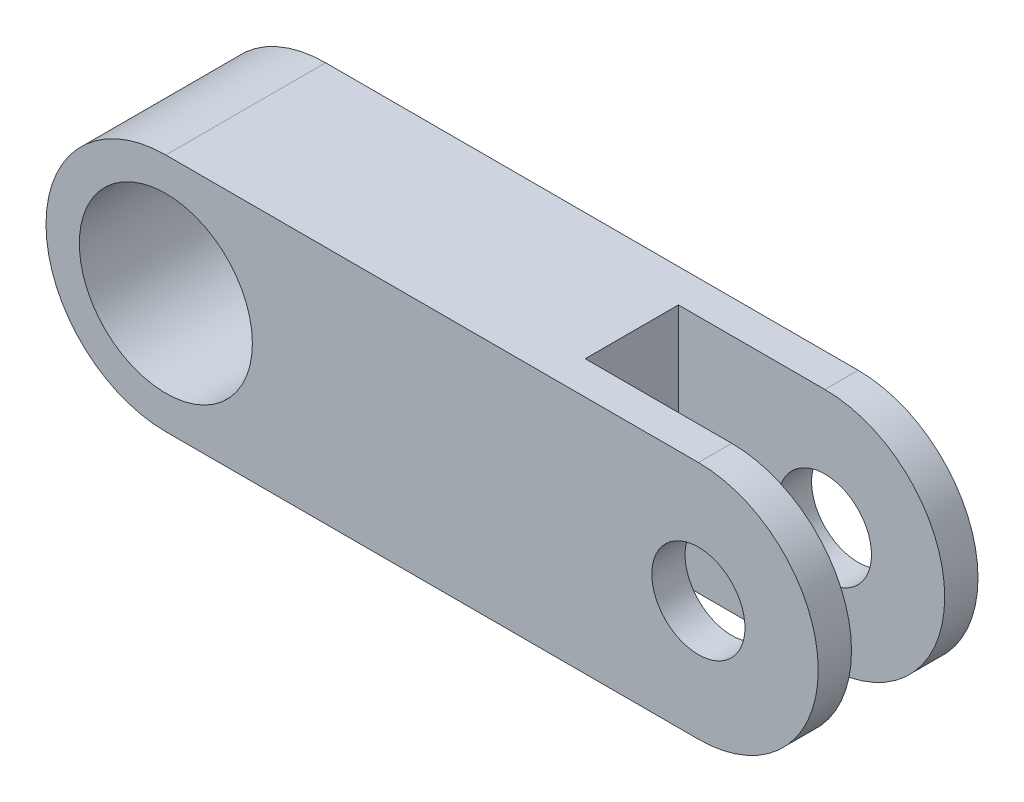
ISO-10303-21;
HEADER;
FILE_DESCRIPTION(('STEP AP214'),'2;1');
FILE_NAME('part.step','',(''),(''),'','','');
FILE_SCHEMA(('AUTOMOTIVE_DESIGN { 1 0 10303 214 1 1 1 1 }'));
ENDSEC;
DATA;
#1=APPLICATION_CONTEXT('core data for automotive mechanical design processes');
#2=APPLICATION_PROTOCOL_DEFINITION('international standard','automotive_design',2000,#1);
#3=PRODUCT_CONTEXT('',#1,'mechanical');
#4=PRODUCT('Part','Part','',(#3));
#5=PRODUCT_RELATED_PRODUCT_CATEGORY('part','',(#4));
#6=PRODUCT_DEFINITION_FORMATION('','',#4);
#7=PRODUCT_DEFINITION_CONTEXT('part definition',#1,'design');
#8=PRODUCT_DEFINITION('design','',#6,#7);
#9=PRODUCT_DEFINITION_SHAPE('','',#8);
#10=(LENGTH_UNIT() NAMED_UNIT(*) SI_UNIT(.MILLI.,.METRE.));
#11=(NAMED_UNIT(*) PLANE_ANGLE_UNIT() SI_UNIT($,.RADIAN.));
#12=(NAMED_UNIT(*) SI_UNIT($,.STERADIAN.) SOLID_ANGLE_UNIT());
#13=UNCERTAINTY_MEASURE_WITH_UNIT(LENGTH_MEASURE(1.E-05),#10,'distance_accuracy_value','');
#14=(GEOMETRIC_REPRESENTATION_CONTEXT(3) GLOBAL_UNCERTAINTY_ASSIGNED_CONTEXT((#13)) GLOBAL_UNIT_ASSIGNED_CONTEXT((#10,
#11,#12)) REPRESENTATION_CONTEXT('',''));
#15=CARTESIAN_POINT('',(0.,0.,0.));
#16=DIRECTION('',(0.,0.,1.));
#17=DIRECTION('',(1.,0.,0.));
#18=AXIS2_PLACEMENT_3D('',#15,#16,#17);
#19=CARTESIAN_POINT('',(-10.,-4.5,3.));
#20=DIRECTION('',(0.,1.,0.));
#21=DIRECTION('',(0.,0.,1.));
#22=AXIS2_PLACEMENT_3D('',#19,#20,#21);
#23=PLANE('',#22);
#24=DIRECTION('',(1.,0.,0.));
#25=VECTOR('',#24,1.);
#26=CARTESIAN_POINT('',(4.5,-4.5,-1.75));
#27=LINE('',#26,#25);
#28=CARTESIAN_POINT('',(4.5,-4.5,-1.75));
#29=VERTEX_POINT('',#28);
#30=CARTESIAN_POINT('',(10.,-4.5,-1.75));
#31=VERTEX_POINT('',#30);
#32=EDGE_CURVE('E130',#29,#31,#27,.T.);
#33=ORIENTED_EDGE('',*,*,#32,.F.);
#34=DIRECTION('',(0.,0.,1.));
#35=VECTOR('',#34,1.);
#36=CARTESIAN_POINT('',(4.5,-4.5,-1.75));
#37=LINE('',#36,#35);
#38=CARTESIAN_POINT('',(4.5,-4.5,1.75));
#39=VERTEX_POINT('',#38);
#40=EDGE_CURVE('E116',#29,#39,#37,.T.);
#41=ORIENTED_EDGE('',*,*,#40,.T.);
#42=DIRECTION('',(1.,0.,0.));
#43=VECTOR('',#42,1.);
#44=CARTESIAN_POINT('',(4.5,-4.5,1.75));
#45=LINE('',#44,#43);
#46=CARTESIAN_POINT('',(10.,-4.5,1.75));
#47=VERTEX_POINT('',#46);
#48=EDGE_CURVE('E145',#39,#47,#45,.T.);
#49=ORIENTED_EDGE('',*,*,#48,.T.);
#50=DIRECTION('',(0.,0.,-1.));
#51=VECTOR('',#50,1.);
#52=CARTESIAN_POINT('',(10.,-4.5,3.));
#53=LINE('',#52,#51);
#54=CARTESIAN_POINT('',(10.,-4.5,3.));
#55=VERTEX_POINT('',#54);
#56=EDGE_CURVE('E49',#55,#47,#53,.T.);
#57=ORIENTED_EDGE('',*,*,#56,.F.);
#58=DIRECTION('',(1.,0.,0.));
#59=VECTOR('',#58,1.);
#60=CARTESIAN_POINT('',(-10.,-4.5,3.));
#61=LINE('',#60,#59);
#62=CARTESIAN_POINT('',(-10.,-4.5,3.));
#63=VERTEX_POINT('',#62);
#64=EDGE_CURVE('E93',#63,#55,#61,.T.);
#65=ORIENTED_EDGE('',*,*,#64,.F.);
#66=DIRECTION('',(0.,0.,-1.));
#67=VECTOR('',#66,1.);
#68=CARTESIAN_POINT('',(-10.,-4.5,3.));
#69=LINE('',#68,#67);
#70=CARTESIAN_POINT('',(-10.,-4.5,-3.));
#71=VERTEX_POINT('',#70);
#72=EDGE_CURVE('E11',#63,#71,#69,.T.);
#73=ORIENTED_EDGE('',*,*,#72,.T.);
#74=DIRECTION('',(1.,0.,0.));
#75=VECTOR('',#74,1.);
#76=CARTESIAN_POINT('',(-10.,-4.5,-3.));
#77=LINE('',#76,#75);
#78=CARTESIAN_POINT('',(10.,-4.5,-3.));
#79=VERTEX_POINT('',#78);
#80=EDGE_CURVE('E191',#71,#79,#77,.T.);
#81=ORIENTED_EDGE('',*,*,#80,.T.);
#82=EDGE_CURVE('E137',#31,#79,#53,.T.);
#83=ORIENTED_EDGE('',*,*,#82,.F.);
#84=EDGE_LOOP('',(#33,#41,#49,#57,#65,#73,#81,#83));
#85=FACE_BOUND('',#84,.T.);
#86=ADVANCED_FACE('F39',(#85),#23,.F.);
#87=CARTESIAN_POINT('',(10.,0.,3.));
#88=DIRECTION('',(0.,0.,-1.));
#89=DIRECTION('',(-1.,0.,0.));
#90=AXIS2_PLACEMENT_3D('',#87,#88,#89);
#91=CYLINDRICAL_SURFACE('',#90,4.5);
#92=CARTESIAN_POINT('',(10.,0.,-1.75));
#93=DIRECTION('',(0.,0.,1.));
#94=DIRECTION('',(1.,0.,0.));
#95=AXIS2_PLACEMENT_3D('',#92,#93,#94);
#96=CIRCLE('',#95,4.5);
#97=CARTESIAN_POINT('',(10.,4.5,-1.75));
#98=VERTEX_POINT('',#97);
#99=EDGE_CURVE('E157',#31,#98,#96,.T.);
#100=ORIENTED_EDGE('',*,*,#99,.F.);
#101=ORIENTED_EDGE('',*,*,#82,.T.);
#102=CARTESIAN_POINT('',(10.,0.,-3.));
#103=DIRECTION('',(0.,0.,1.));
#104=DIRECTION('',(1.,0.,0.));
#105=AXIS2_PLACEMENT_3D('',#102,#103,#104);
#106=CIRCLE('',#105,4.5);
#107=CARTESIAN_POINT('',(10.,4.5,-3.));
#108=VERTEX_POINT('',#107);
#109=EDGE_CURVE('E194',#79,#108,#106,.T.);
#110=ORIENTED_EDGE('',*,*,#109,.T.);
#111=DIRECTION('',(0.,0.,-1.));
#112=VECTOR('',#111,1.);
#113=CARTESIAN_POINT('',(10.,4.5,3.));
#114=LINE('',#113,#112);
#115=EDGE_CURVE('E202',#98,#108,#114,.T.);
#116=ORIENTED_EDGE('',*,*,#115,.F.);
#117=EDGE_LOOP('',(#100,#101,#110,#116));
#118=FACE_BOUND('',#117,.T.);
#119=ADVANCED_FACE('F239',(#118),#91,.T.);
#120=CARTESIAN_POINT('',(-10.,4.5,3.));
#121=DIRECTION('',(0.,-1.,0.));
#122=DIRECTION('',(0.,0.,-1.));
#123=AXIS2_PLACEMENT_3D('',#120,#121,#122);
#124=PLANE('',#123);
#125=DIRECTION('',(-1.,0.,0.));
#126=VECTOR('',#125,1.);
#127=CARTESIAN_POINT('',(4.5,4.5,-1.75));
#128=LINE('',#127,#126);
#129=CARTESIAN_POINT('',(4.5,4.5,-1.75));
#130=VERTEX_POINT('',#129);
#131=EDGE_CURVE('E125',#98,#130,#128,.T.);
#132=ORIENTED_EDGE('',*,*,#131,.F.);
#133=ORIENTED_EDGE('',*,*,#115,.T.);
#134=DIRECTION('',(-1.,0.,0.));
#135=VECTOR('',#134,1.);
#136=CARTESIAN_POINT('',(-10.,4.5,-3.));
#137=LINE('',#136,#135);
#138=CARTESIAN_POINT('',(-10.,4.5,-3.));
#139=VERTEX_POINT('',#138);
#140=EDGE_CURVE('E86',#108,#139,#137,.T.);
#141=ORIENTED_EDGE('',*,*,#140,.T.);
#142=DIRECTION('',(0.,0.,-1.));
#143=VECTOR('',#142,1.);
#144=CARTESIAN_POINT('',(-10.,4.5,3.));
#145=LINE('',#144,#143);
#146=CARTESIAN_POINT('',(-10.,4.5,3.));
#147=VERTEX_POINT('',#146);
#148=EDGE_CURVE('E187',#147,#139,#145,.T.);
#149=ORIENTED_EDGE('',*,*,#148,.F.);
#150=DIRECTION('',(-1.,0.,0.));
#151=VECTOR('',#150,1.);
#152=CARTESIAN_POINT('',(-10.,4.5,3.));
#153=LINE('',#152,#151);
#154=CARTESIAN_POINT('',(10.,4.5,3.));
#155=VERTEX_POINT('',#154);
#156=EDGE_CURVE('E66',#155,#147,#153,.T.);
#157=ORIENTED_EDGE('',*,*,#156,.F.);
#158=CARTESIAN_POINT('',(10.,4.5,1.75));
#159=VERTEX_POINT('',#158);
#160=EDGE_CURVE('E203',#155,#159,#114,.T.);
#161=ORIENTED_EDGE('',*,*,#160,.T.);
#162=DIRECTION('',(-1.,0.,0.));
#163=VECTOR('',#162,1.);
#164=CARTESIAN_POINT('',(4.5,4.5,1.75));
#165=LINE('',#164,#163);
#166=CARTESIAN_POINT('',(4.5,4.5,1.75));
#167=VERTEX_POINT('',#166);
#168=EDGE_CURVE('E134',#159,#167,#165,.T.);
#169=ORIENTED_EDGE('',*,*,#168,.T.);
#170=DIRECTION('',(0.,0.,1.));
#171=VECTOR('',#170,1.);
#172=CARTESIAN_POINT('',(4.5,4.5,-1.75));
#173=LINE('',#172,#171);
#174=EDGE_CURVE('E124',#130,#167,#173,.T.);
#175=ORIENTED_EDGE('',*,*,#174,.F.);
#176=EDGE_LOOP('',(#132,#133,#141,#149,#157,#161,#169,#175));
#177=FACE_BOUND('',#176,.T.);
#178=ADVANCED_FACE('F234',(#177),#124,.F.);
#179=CARTESIAN_POINT('',(10.,0.,3.));
#180=DIRECTION('',(0.,0.,-1.));
#181=DIRECTION('',(-1.,0.,0.));
#182=AXIS2_PLACEMENT_3D('',#179,#180,#181);
#183=CYLINDRICAL_SURFACE('',#182,1.75);
#184=CARTESIAN_POINT('',(10.,0.,-3.));
#185=DIRECTION('',(0.,0.,1.));
#186=DIRECTION('',(1.,0.,0.));
#187=AXIS2_PLACEMENT_3D('',#184,#185,#186);
#188=CIRCLE('',#187,1.75);
#189=CARTESIAN_POINT('',(11.75,0.,-3.));
#190=VERTEX_POINT('',#189);
#191=EDGE_CURVE('E160',#190,#190,#188,.T.);
#192=ORIENTED_EDGE('',*,*,#191,.F.);
#193=EDGE_LOOP('',(#192));
#194=FACE_BOUND('',#193,.T.);
#195=CARTESIAN_POINT('',(10.,0.,-1.75));
#196=DIRECTION('',(0.,0.,1.));
#197=DIRECTION('',(1.,0.,0.));
#198=AXIS2_PLACEMENT_3D('',#195,#196,#197);
#199=CIRCLE('',#198,1.75);
#200=CARTESIAN_POINT('',(11.75,0.,-1.75));
#201=VERTEX_POINT('',#200);
#202=EDGE_CURVE('E43',#201,#201,#199,.T.);
#203=ORIENTED_EDGE('',*,*,#202,.T.);
#204=EDGE_LOOP('',(#203));
#205=FACE_BOUND('',#204,.T.);
#206=ADVANCED_FACE('F220',(#194,#205),#183,.F.);
#207=CARTESIAN_POINT('',(-10.,0.,3.));
#208=DIRECTION('',(0.,0.,1.));
#209=DIRECTION('',(1.,0.,0.));
#210=AXIS2_PLACEMENT_3D('',#207,#208,#209);
#211=PLANE('',#210);
#212=CARTESIAN_POINT('',(-10.,0.,3.));
#213=DIRECTION('',(0.,0.,1.));
#214=DIRECTION('',(1.,0.,0.));
#215=AXIS2_PLACEMENT_3D('',#212,#213,#214);
#216=CIRCLE('',#215,3.25);
#217=CARTESIAN_POINT('',(-6.75,0.,3.));
#218=VERTEX_POINT('',#217);
#219=EDGE_CURVE('E169',#218,#218,#216,.T.);
#220=ORIENTED_EDGE('',*,*,#219,.F.);
#221=EDGE_LOOP('',(#220));
#222=FACE_BOUND('',#221,.T.);
#223=CARTESIAN_POINT('',(-10.,0.,3.));
#224=DIRECTION('',(0.,0.,1.));
#225=DIRECTION('',(1.,0.,0.));
#226=AXIS2_PLACEMENT_3D('',#223,#224,#225);
#227=CIRCLE('',#226,4.5);
#228=EDGE_CURVE('E177',#147,#63,#227,.T.);
#229=ORIENTED_EDGE('',*,*,#228,.T.);
#230=ORIENTED_EDGE('',*,*,#64,.T.);
#231=CARTESIAN_POINT('',(10.,0.,3.));
#232=DIRECTION('',(0.,0.,1.));
#233=DIRECTION('',(1.,0.,0.));
#234=AXIS2_PLACEMENT_3D('',#231,#232,#233);
#235=CIRCLE('',#234,4.5);
#236=EDGE_CURVE('E182',#55,#155,#235,.T.);
#237=ORIENTED_EDGE('',*,*,#236,.T.);
#238=ORIENTED_EDGE('',*,*,#156,.T.);
#239=EDGE_LOOP('',(#229,#230,#237,#238));
#240=FACE_BOUND('',#239,.T.);
#241=CARTESIAN_POINT('',(10.,0.,3.));
#242=DIRECTION('',(0.,0.,1.));
#243=DIRECTION('',(1.,0.,0.));
#244=AXIS2_PLACEMENT_3D('',#241,#242,#243);
#245=CIRCLE('',#244,1.75);
#246=CARTESIAN_POINT('',(11.75,0.,3.));
#247=VERTEX_POINT('',#246);
#248=EDGE_CURVE('E161',#247,#247,#245,.T.);
#249=ORIENTED_EDGE('',*,*,#248,.F.);
#250=EDGE_LOOP('',(#249));
#251=FACE_BOUND('',#250,.T.);
#252=ADVANCED_FACE('F223',(#222,#240,#251),#211,.T.);
#253=CARTESIAN_POINT('',(-10.,0.,-3.));
#254=DIRECTION('',(0.,0.,1.));
#255=DIRECTION('',(1.,0.,0.));
#256=AXIS2_PLACEMENT_3D('',#253,#254,#255);
#257=PLANE('',#256);
#258=CARTESIAN_POINT('',(-10.,0.,-3.));
#259=DIRECTION('',(0.,0.,1.));
#260=DIRECTION('',(1.,0.,0.));
#261=AXIS2_PLACEMENT_3D('',#258,#259,#260);
#262=CIRCLE('',#261,4.5);
#263=EDGE_CURVE('E173',#139,#71,#262,.T.);
#264=ORIENTED_EDGE('',*,*,#263,.F.);
#265=ORIENTED_EDGE('',*,*,#140,.F.);
#266=ORIENTED_EDGE('',*,*,#109,.F.);
#267=ORIENTED_EDGE('',*,*,#80,.F.);
#268=EDGE_LOOP('',(#264,#265,#266,#267));
#269=FACE_BOUND('',#268,.T.);
#270=CARTESIAN_POINT('',(-10.,0.,-3.));
#271=DIRECTION('',(0.,0.,1.));
#272=DIRECTION('',(1.,0.,0.));
#273=AXIS2_PLACEMENT_3D('',#270,#271,#272);
#274=CIRCLE('',#273,3.25);
#275=CARTESIAN_POINT('',(-6.75,0.,-3.));
#276=VERTEX_POINT('',#275);
#277=EDGE_CURVE('E165',#276,#276,#274,.T.);
#278=ORIENTED_EDGE('',*,*,#277,.T.);
#279=EDGE_LOOP('',(#278));
#280=FACE_BOUND('',#279,.T.);
#281=ORIENTED_EDGE('',*,*,#191,.T.);
#282=EDGE_LOOP('',(#281));
#283=FACE_BOUND('',#282,.T.);
#284=ADVANCED_FACE('F225',(#269,#280,#283),#257,.F.);
#285=CARTESIAN_POINT('',(-10.,0.,3.));
#286=DIRECTION('',(0.,0.,-1.));
#287=DIRECTION('',(-1.,0.,0.));
#288=AXIS2_PLACEMENT_3D('',#285,#286,#287);
#289=CYLINDRICAL_SURFACE('',#288,4.5);
#290=ORIENTED_EDGE('',*,*,#263,.T.);
#291=ORIENTED_EDGE('',*,*,#72,.F.);
#292=ORIENTED_EDGE('',*,*,#228,.F.);
#293=ORIENTED_EDGE('',*,*,#148,.T.);
#294=EDGE_LOOP('',(#290,#291,#292,#293));
#295=FACE_BOUND('',#294,.T.);
#296=ADVANCED_FACE('F41',(#295),#289,.T.);
#297=CARTESIAN_POINT('',(10.,0.,1.75));
#298=DIRECTION('',(0.,0.,1.));
#299=DIRECTION('',(1.,0.,0.));
#300=AXIS2_PLACEMENT_3D('',#297,#298,#299);
#301=CIRCLE('',#300,4.5);
#302=EDGE_CURVE('E154',#47,#159,#301,.T.);
#303=ORIENTED_EDGE('',*,*,#302,.T.);
#304=ORIENTED_EDGE('',*,*,#160,.F.);
#305=ORIENTED_EDGE('',*,*,#236,.F.);
#306=ORIENTED_EDGE('',*,*,#56,.T.);
#307=EDGE_LOOP('',(#303,#304,#305,#306));
#308=FACE_BOUND('',#307,.T.);
#309=ADVANCED_FACE('F245',(#308),#91,.T.);
#310=CARTESIAN_POINT('',(-10.,0.,3.));
#311=DIRECTION('',(0.,0.,-1.));
#312=DIRECTION('',(-1.,0.,0.));
#313=AXIS2_PLACEMENT_3D('',#310,#311,#312);
#314=CYLINDRICAL_SURFACE('',#313,3.25);
#315=ORIENTED_EDGE('',*,*,#219,.T.);
#316=EDGE_LOOP('',(#315));
#317=FACE_BOUND('',#316,.T.);
#318=ORIENTED_EDGE('',*,*,#277,.F.);
#319=EDGE_LOOP('',(#318));
#320=FACE_BOUND('',#319,.T.);
#321=ADVANCED_FACE('F218',(#317,#320),#314,.F.);
#322=CARTESIAN_POINT('',(10.,0.,1.75));
#323=DIRECTION('',(0.,0.,1.));
#324=DIRECTION('',(1.,0.,0.));
#325=AXIS2_PLACEMENT_3D('',#322,#323,#324);
#326=CIRCLE('',#325,1.75);
#327=CARTESIAN_POINT('',(11.75,0.,1.75));
#328=VERTEX_POINT('',#327);
#329=EDGE_CURVE('E152',#328,#328,#326,.T.);
#330=ORIENTED_EDGE('',*,*,#329,.F.);
#331=EDGE_LOOP('',(#330));
#332=FACE_BOUND('',#331,.T.);
#333=ORIENTED_EDGE('',*,*,#248,.T.);
#334=EDGE_LOOP('',(#333));
#335=FACE_BOUND('',#334,.T.);
#336=ADVANCED_FACE('F215',(#332,#335),#183,.F.);
#337=CARTESIAN_POINT('',(0.,0.,-1.75));
#338=DIRECTION('',(0.,0.,1.));
#339=DIRECTION('',(1.,0.,0.));
#340=AXIS2_PLACEMENT_3D('',#337,#338,#339);
#341=PLANE('',#340);
#342=ORIENTED_EDGE('',*,*,#202,.F.);
#343=EDGE_LOOP('',(#342));
#344=FACE_BOUND('',#343,.T.);
#345=ORIENTED_EDGE('',*,*,#99,.T.);
#346=ORIENTED_EDGE('',*,*,#131,.T.);
#347=DIRECTION('',(0.,-1.,0.));
#348=VECTOR('',#347,1.);
#349=CARTESIAN_POINT('',(4.5,4.5,-1.75));
#350=LINE('',#349,#348);
#351=EDGE_CURVE('E119',#130,#29,#350,.T.);
#352=ORIENTED_EDGE('',*,*,#351,.T.);
#353=ORIENTED_EDGE('',*,*,#32,.T.);
#354=EDGE_LOOP('',(#345,#346,#352,#353));
#355=FACE_BOUND('',#354,.T.);
#356=ADVANCED_FACE('F129',(#344,#355),#341,.T.);
#357=CARTESIAN_POINT('',(0.,0.,1.75));
#358=DIRECTION('',(0.,0.,1.));
#359=DIRECTION('',(1.,0.,0.));
#360=AXIS2_PLACEMENT_3D('',#357,#358,#359);
#361=PLANE('',#360);
#362=ORIENTED_EDGE('',*,*,#329,.T.);
#363=EDGE_LOOP('',(#362));
#364=FACE_BOUND('',#363,.T.);
#365=ORIENTED_EDGE('',*,*,#302,.F.);
#366=ORIENTED_EDGE('',*,*,#48,.F.);
#367=DIRECTION('',(0.,-1.,0.));
#368=VECTOR('',#367,1.);
#369=CARTESIAN_POINT('',(4.5,4.5,1.75));
#370=LINE('',#369,#368);
#371=EDGE_CURVE('E57',#167,#39,#370,.T.);
#372=ORIENTED_EDGE('',*,*,#371,.F.);
#373=ORIENTED_EDGE('',*,*,#168,.F.);
#374=EDGE_LOOP('',(#365,#366,#372,#373));
#375=FACE_BOUND('',#374,.T.);
#376=ADVANCED_FACE('F213',(#364,#375),#361,.F.);
#377=CARTESIAN_POINT('',(4.5,4.5,-1.75));
#378=DIRECTION('',(-1.,0.,0.));
#379=DIRECTION('',(0.,-1.,0.));
#380=AXIS2_PLACEMENT_3D('',#377,#378,#379);
#381=PLANE('',#380);
#382=ORIENTED_EDGE('',*,*,#371,.T.);
#383=ORIENTED_EDGE('',*,*,#40,.F.);
#384=ORIENTED_EDGE('',*,*,#351,.F.);
#385=ORIENTED_EDGE('',*,*,#174,.T.);
#386=EDGE_LOOP('',(#382,#383,#384,#385));
#387=FACE_BOUND('',#386,.T.);
#388=ADVANCED_FACE('F118',(#387),#381,.F.);
#389=CLOSED_SHELL('',(#86,#119,#178,#206,#252,#284,#296,#309,#321,#336,#356,#376,#388));
#390=MANIFOLD_SOLID_BREP('B2',#389);
#391=ADVANCED_BREP_SHAPE_REPRESENTATION('',(#18,#390),#14);
#392=SHAPE_DEFINITION_REPRESENTATION(#9,#391);
ENDSEC;
END-ISO-10303-21;
